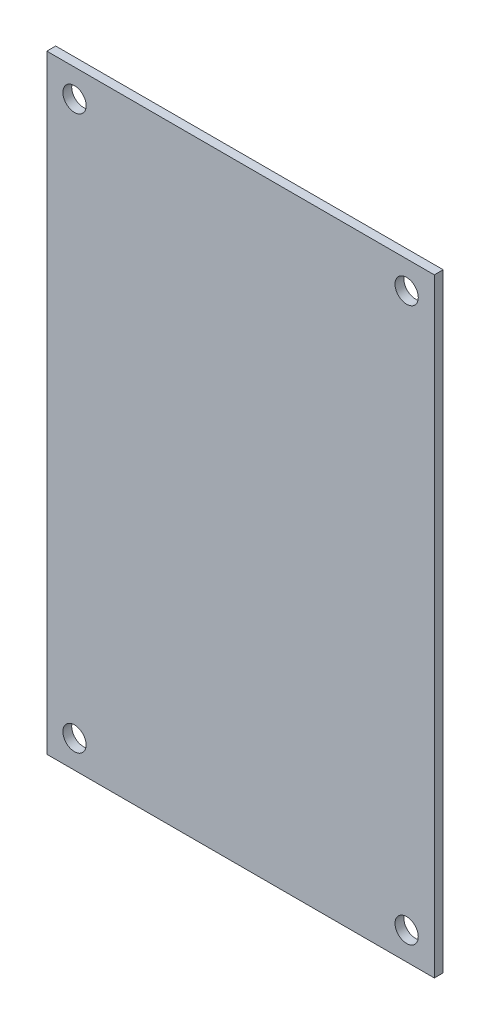
ISO-10303-21;
HEADER;
FILE_DESCRIPTION(('STEP AP214'),'2;1');
FILE_NAME('part.step','',(''),(''),'','','');
FILE_SCHEMA(('AUTOMOTIVE_DESIGN { 1 0 10303 214 1 1 1 1 }'));
ENDSEC;
DATA;
#1=APPLICATION_CONTEXT('core data for automotive mechanical design processes');
#2=APPLICATION_PROTOCOL_DEFINITION('international standard','automotive_design',2000,#1);
#3=PRODUCT_CONTEXT('',#1,'mechanical');
#4=PRODUCT('Part','Part','',(#3));
#5=PRODUCT_RELATED_PRODUCT_CATEGORY('part','',(#4));
#6=PRODUCT_DEFINITION_FORMATION('','',#4);
#7=PRODUCT_DEFINITION_CONTEXT('part definition',#1,'design');
#8=PRODUCT_DEFINITION('design','',#6,#7);
#9=PRODUCT_DEFINITION_SHAPE('','',#8);
#10=(LENGTH_UNIT() NAMED_UNIT(*) SI_UNIT(.MILLI.,.METRE.));
#11=(NAMED_UNIT(*) PLANE_ANGLE_UNIT() SI_UNIT($,.RADIAN.));
#12=(NAMED_UNIT(*) SI_UNIT($,.STERADIAN.) SOLID_ANGLE_UNIT());
#13=UNCERTAINTY_MEASURE_WITH_UNIT(LENGTH_MEASURE(1.E-05),#10,'distance_accuracy_value','');
#14=(GEOMETRIC_REPRESENTATION_CONTEXT(3) GLOBAL_UNCERTAINTY_ASSIGNED_CONTEXT((#13)) GLOBAL_UNIT_ASSIGNED_CONTEXT((#10,
#11,#12)) REPRESENTATION_CONTEXT('',''));
#15=CARTESIAN_POINT('',(0.,0.,0.));
#16=DIRECTION('',(0.,0.,1.));
#17=DIRECTION('',(1.,0.,0.));
#18=AXIS2_PLACEMENT_3D('',#15,#16,#17);
#19=CARTESIAN_POINT('',(35.,55.,0.));
#20=DIRECTION('',(0.,0.,1.));
#21=DIRECTION('',(1.,0.,0.));
#22=AXIS2_PLACEMENT_3D('',#19,#20,#21);
#23=PLANE('',#22);
#24=CARTESIAN_POINT('',(5.,5.,0.));
#25=DIRECTION('',(0.,0.,1.));
#26=DIRECTION('',(1.,0.,0.));
#27=AXIS2_PLACEMENT_3D('',#24,#25,#26);
#28=CIRCLE('',#27,2.1);
#29=CARTESIAN_POINT('',(7.1,5.,0.));
#30=VERTEX_POINT('',#29);
#31=EDGE_CURVE('E94',#30,#30,#28,.T.);
#32=ORIENTED_EDGE('',*,*,#31,.T.);
#33=EDGE_LOOP('',(#32));
#34=FACE_BOUND('',#33,.T.);
#35=CARTESIAN_POINT('',(5.,105.,0.));
#36=DIRECTION('',(0.,0.,1.));
#37=DIRECTION('',(1.,0.,0.));
#38=AXIS2_PLACEMENT_3D('',#35,#36,#37);
#39=CIRCLE('',#38,2.1);
#40=CARTESIAN_POINT('',(7.1,105.,0.));
#41=VERTEX_POINT('',#40);
#42=EDGE_CURVE('E98',#41,#41,#39,.T.);
#43=ORIENTED_EDGE('',*,*,#42,.T.);
#44=EDGE_LOOP('',(#43));
#45=FACE_BOUND('',#44,.T.);
#46=CARTESIAN_POINT('',(65.,5.,0.));
#47=DIRECTION('',(0.,0.,1.));
#48=DIRECTION('',(1.,0.,0.));
#49=AXIS2_PLACEMENT_3D('',#46,#47,#48);
#50=CIRCLE('',#49,2.1);
#51=CARTESIAN_POINT('',(67.1,5.,0.));
#52=VERTEX_POINT('',#51);
#53=EDGE_CURVE('E101',#52,#52,#50,.T.);
#54=ORIENTED_EDGE('',*,*,#53,.T.);
#55=EDGE_LOOP('',(#54));
#56=FACE_BOUND('',#55,.T.);
#57=CARTESIAN_POINT('',(65.,105.,0.));
#58=DIRECTION('',(0.,0.,1.));
#59=DIRECTION('',(1.,0.,0.));
#60=AXIS2_PLACEMENT_3D('',#57,#58,#59);
#61=CIRCLE('',#60,2.1);
#62=CARTESIAN_POINT('',(67.1,105.,0.));
#63=VERTEX_POINT('',#62);
#64=EDGE_CURVE('E20',#63,#63,#61,.T.);
#65=ORIENTED_EDGE('',*,*,#64,.T.);
#66=EDGE_LOOP('',(#65));
#67=FACE_BOUND('',#66,.T.);
#68=DIRECTION('',(0.,1.,0.));
#69=VECTOR('',#68,1.);
#70=CARTESIAN_POINT('',(0.,0.,0.));
#71=LINE('',#70,#69);
#72=CARTESIAN_POINT('',(0.,110.,0.));
#73=VERTEX_POINT('',#72);
#74=CARTESIAN_POINT('',(0.,0.,0.));
#75=VERTEX_POINT('',#74);
#76=EDGE_CURVE('E62',#73,#75,#71,.F.);
#77=ORIENTED_EDGE('',*,*,#76,.F.);
#78=DIRECTION('',(1.,0.,0.));
#79=VECTOR('',#78,1.);
#80=CARTESIAN_POINT('',(0.,110.,0.));
#81=LINE('',#80,#79);
#82=CARTESIAN_POINT('',(70.,110.,0.));
#83=VERTEX_POINT('',#82);
#84=EDGE_CURVE('E109',#83,#73,#81,.F.);
#85=ORIENTED_EDGE('',*,*,#84,.F.);
#86=DIRECTION('',(0.,1.,0.));
#87=VECTOR('',#86,1.);
#88=CARTESIAN_POINT('',(70.,110.,0.));
#89=LINE('',#88,#87);
#90=CARTESIAN_POINT('',(70.,0.,0.));
#91=VERTEX_POINT('',#90);
#92=EDGE_CURVE('E73',#91,#83,#89,.T.);
#93=ORIENTED_EDGE('',*,*,#92,.F.);
#94=DIRECTION('',(1.,0.,0.));
#95=VECTOR('',#94,1.);
#96=CARTESIAN_POINT('',(70.,0.,0.));
#97=LINE('',#96,#95);
#98=EDGE_CURVE('E57',#75,#91,#97,.T.);
#99=ORIENTED_EDGE('',*,*,#98,.F.);
#100=EDGE_LOOP('',(#77,#85,#93,#99));
#101=FACE_BOUND('',#100,.T.);
#102=ADVANCED_FACE('F17',(#34,#45,#56,#67,#101),#23,.F.);
#103=CARTESIAN_POINT('',(0.,0.,0.));
#104=DIRECTION('',(-1.,0.,0.));
#105=DIRECTION('',(0.,0.,1.));
#106=AXIS2_PLACEMENT_3D('',#103,#104,#105);
#107=PLANE('',#106);
#108=ORIENTED_EDGE('',*,*,#76,.T.);
#109=DIRECTION('',(0.,0.,-1.));
#110=VECTOR('',#109,1.);
#111=CARTESIAN_POINT('',(0.,0.,0.));
#112=LINE('',#111,#110);
#113=CARTESIAN_POINT('',(0.,0.,1.6));
#114=VERTEX_POINT('',#113);
#115=EDGE_CURVE('E64',#114,#75,#112,.T.);
#116=ORIENTED_EDGE('',*,*,#115,.F.);
#117=DIRECTION('',(0.,1.,0.));
#118=VECTOR('',#117,1.);
#119=CARTESIAN_POINT('',(0.,55.,1.6));
#120=LINE('',#119,#118);
#121=CARTESIAN_POINT('',(0.,110.,1.6));
#122=VERTEX_POINT('',#121);
#123=EDGE_CURVE('E97',#122,#114,#120,.F.);
#124=ORIENTED_EDGE('',*,*,#123,.F.);
#125=DIRECTION('',(0.,0.,1.));
#126=VECTOR('',#125,1.);
#127=CARTESIAN_POINT('',(0.,110.,0.));
#128=LINE('',#127,#126);
#129=EDGE_CURVE('E67',#73,#122,#128,.T.);
#130=ORIENTED_EDGE('',*,*,#129,.F.);
#131=EDGE_LOOP('',(#108,#116,#124,#130));
#132=FACE_BOUND('',#131,.T.);
#133=ADVANCED_FACE('F63',(#132),#107,.T.);
#134=CARTESIAN_POINT('',(70.,0.,0.));
#135=DIRECTION('',(0.,-1.,0.));
#136=DIRECTION('',(0.,0.,-1.));
#137=AXIS2_PLACEMENT_3D('',#134,#135,#136);
#138=PLANE('',#137);
#139=ORIENTED_EDGE('',*,*,#98,.T.);
#140=DIRECTION('',(0.,0.,-1.));
#141=VECTOR('',#140,1.);
#142=CARTESIAN_POINT('',(70.,0.,0.));
#143=LINE('',#142,#141);
#144=CARTESIAN_POINT('',(70.,0.,1.6));
#145=VERTEX_POINT('',#144);
#146=EDGE_CURVE('E75',#145,#91,#143,.T.);
#147=ORIENTED_EDGE('',*,*,#146,.F.);
#148=DIRECTION('',(1.,0.,0.));
#149=VECTOR('',#148,1.);
#150=CARTESIAN_POINT('',(35.,0.,1.6));
#151=LINE('',#150,#149);
#152=EDGE_CURVE('E79',#114,#145,#151,.T.);
#153=ORIENTED_EDGE('',*,*,#152,.F.);
#154=ORIENTED_EDGE('',*,*,#115,.T.);
#155=EDGE_LOOP('',(#139,#147,#153,#154));
#156=FACE_BOUND('',#155,.T.);
#157=ADVANCED_FACE('F77',(#156),#138,.T.);
#158=CARTESIAN_POINT('',(70.,110.,0.));
#159=DIRECTION('',(1.,0.,0.));
#160=DIRECTION('',(0.,0.,-1.));
#161=AXIS2_PLACEMENT_3D('',#158,#159,#160);
#162=PLANE('',#161);
#163=ORIENTED_EDGE('',*,*,#92,.T.);
#164=DIRECTION('',(0.,0.,1.));
#165=VECTOR('',#164,1.);
#166=CARTESIAN_POINT('',(70.,110.,0.));
#167=LINE('',#166,#165);
#168=CARTESIAN_POINT('',(70.,110.,1.6));
#169=VERTEX_POINT('',#168);
#170=EDGE_CURVE('E35',#169,#83,#167,.F.);
#171=ORIENTED_EDGE('',*,*,#170,.F.);
#172=DIRECTION('',(0.,1.,0.));
#173=VECTOR('',#172,1.);
#174=CARTESIAN_POINT('',(70.,55.,1.6));
#175=LINE('',#174,#173);
#176=EDGE_CURVE('E124',#145,#169,#175,.T.);
#177=ORIENTED_EDGE('',*,*,#176,.F.);
#178=ORIENTED_EDGE('',*,*,#146,.T.);
#179=EDGE_LOOP('',(#163,#171,#177,#178));
#180=FACE_BOUND('',#179,.T.);
#181=ADVANCED_FACE('F122',(#180),#162,.T.);
#182=CARTESIAN_POINT('',(0.,110.,0.));
#183=DIRECTION('',(0.,1.,0.));
#184=DIRECTION('',(0.,0.,1.));
#185=AXIS2_PLACEMENT_3D('',#182,#183,#184);
#186=PLANE('',#185);
#187=ORIENTED_EDGE('',*,*,#84,.T.);
#188=ORIENTED_EDGE('',*,*,#129,.T.);
#189=DIRECTION('',(1.,0.,0.));
#190=VECTOR('',#189,1.);
#191=CARTESIAN_POINT('',(35.,110.,1.6));
#192=LINE('',#191,#190);
#193=EDGE_CURVE('E93',#169,#122,#192,.F.);
#194=ORIENTED_EDGE('',*,*,#193,.F.);
#195=ORIENTED_EDGE('',*,*,#170,.T.);
#196=EDGE_LOOP('',(#187,#188,#194,#195));
#197=FACE_BOUND('',#196,.T.);
#198=ADVANCED_FACE('F131',(#197),#186,.T.);
#199=CARTESIAN_POINT('',(65.,105.,0.));
#200=DIRECTION('',(0.,0.,1.));
#201=DIRECTION('',(1.,0.,0.));
#202=AXIS2_PLACEMENT_3D('',#199,#200,#201);
#203=CYLINDRICAL_SURFACE('',#202,2.1);
#204=ORIENTED_EDGE('',*,*,#64,.F.);
#205=EDGE_LOOP('',(#204));
#206=FACE_BOUND('',#205,.T.);
#207=CARTESIAN_POINT('',(65.,105.,1.6));
#208=DIRECTION('',(0.,0.,1.));
#209=DIRECTION('',(1.,0.,0.));
#210=AXIS2_PLACEMENT_3D('',#207,#208,#209);
#211=CIRCLE('',#210,2.1);
#212=CARTESIAN_POINT('',(67.1,105.,1.6));
#213=VERTEX_POINT('',#212);
#214=EDGE_CURVE('E90',#213,#213,#211,.F.);
#215=ORIENTED_EDGE('',*,*,#214,.F.);
#216=EDGE_LOOP('',(#215));
#217=FACE_BOUND('',#216,.T.);
#218=ADVANCED_FACE('F133',(#206,#217),#203,.F.);
#219=CARTESIAN_POINT('',(65.,5.,0.));
#220=DIRECTION('',(0.,0.,1.));
#221=DIRECTION('',(1.,0.,0.));
#222=AXIS2_PLACEMENT_3D('',#219,#220,#221);
#223=CYLINDRICAL_SURFACE('',#222,2.1);
#224=ORIENTED_EDGE('',*,*,#53,.F.);
#225=EDGE_LOOP('',(#224));
#226=FACE_BOUND('',#225,.T.);
#227=CARTESIAN_POINT('',(65.,5.,1.6));
#228=DIRECTION('',(0.,0.,1.));
#229=DIRECTION('',(1.,0.,0.));
#230=AXIS2_PLACEMENT_3D('',#227,#228,#229);
#231=CIRCLE('',#230,2.1);
#232=CARTESIAN_POINT('',(67.1,5.,1.6));
#233=VERTEX_POINT('',#232);
#234=EDGE_CURVE('E87',#233,#233,#231,.F.);
#235=ORIENTED_EDGE('',*,*,#234,.F.);
#236=EDGE_LOOP('',(#235));
#237=FACE_BOUND('',#236,.T.);
#238=ADVANCED_FACE('F140',(#226,#237),#223,.F.);
#239=CARTESIAN_POINT('',(5.,105.,0.));
#240=DIRECTION('',(0.,0.,1.));
#241=DIRECTION('',(1.,0.,0.));
#242=AXIS2_PLACEMENT_3D('',#239,#240,#241);
#243=CYLINDRICAL_SURFACE('',#242,2.1);
#244=ORIENTED_EDGE('',*,*,#42,.F.);
#245=EDGE_LOOP('',(#244));
#246=FACE_BOUND('',#245,.T.);
#247=CARTESIAN_POINT('',(5.,105.,1.6));
#248=DIRECTION('',(0.,0.,1.));
#249=DIRECTION('',(1.,0.,0.));
#250=AXIS2_PLACEMENT_3D('',#247,#248,#249);
#251=CIRCLE('',#250,2.1);
#252=CARTESIAN_POINT('',(7.1,105.,1.6));
#253=VERTEX_POINT('',#252);
#254=EDGE_CURVE('E26',#253,#253,#251,.F.);
#255=ORIENTED_EDGE('',*,*,#254,.F.);
#256=EDGE_LOOP('',(#255));
#257=FACE_BOUND('',#256,.T.);
#258=ADVANCED_FACE('F151',(#246,#257),#243,.F.);
#259=CARTESIAN_POINT('',(5.,5.,0.));
#260=DIRECTION('',(0.,0.,1.));
#261=DIRECTION('',(1.,0.,0.));
#262=AXIS2_PLACEMENT_3D('',#259,#260,#261);
#263=CYLINDRICAL_SURFACE('',#262,2.1);
#264=ORIENTED_EDGE('',*,*,#31,.F.);
#265=EDGE_LOOP('',(#264));
#266=FACE_BOUND('',#265,.T.);
#267=CARTESIAN_POINT('',(5.,5.,1.6));
#268=DIRECTION('',(0.,0.,1.));
#269=DIRECTION('',(1.,0.,0.));
#270=AXIS2_PLACEMENT_3D('',#267,#268,#269);
#271=CIRCLE('',#270,2.1);
#272=CARTESIAN_POINT('',(7.1,5.,1.6));
#273=VERTEX_POINT('',#272);
#274=EDGE_CURVE('E11',#273,#273,#271,.F.);
#275=ORIENTED_EDGE('',*,*,#274,.F.);
#276=EDGE_LOOP('',(#275));
#277=FACE_BOUND('',#276,.T.);
#278=ADVANCED_FACE('F145',(#266,#277),#263,.F.);
#279=CARTESIAN_POINT('',(35.,55.,1.6));
#280=DIRECTION('',(0.,0.,1.));
#281=DIRECTION('',(1.,0.,0.));
#282=AXIS2_PLACEMENT_3D('',#279,#280,#281);
#283=PLANE('',#282);
#284=ORIENTED_EDGE('',*,*,#274,.T.);
#285=EDGE_LOOP('',(#284));
#286=FACE_BOUND('',#285,.T.);
#287=ORIENTED_EDGE('',*,*,#254,.T.);
#288=EDGE_LOOP('',(#287));
#289=FACE_BOUND('',#288,.T.);
#290=ORIENTED_EDGE('',*,*,#234,.T.);
#291=EDGE_LOOP('',(#290));
#292=FACE_BOUND('',#291,.T.);
#293=ORIENTED_EDGE('',*,*,#214,.T.);
#294=EDGE_LOOP('',(#293));
#295=FACE_BOUND('',#294,.T.);
#296=ORIENTED_EDGE('',*,*,#176,.T.);
#297=ORIENTED_EDGE('',*,*,#193,.T.);
#298=ORIENTED_EDGE('',*,*,#123,.T.);
#299=ORIENTED_EDGE('',*,*,#152,.T.);
#300=EDGE_LOOP('',(#296,#297,#298,#299));
#301=FACE_BOUND('',#300,.T.);
#302=ADVANCED_FACE('F128',(#286,#289,#292,#295,#301),#283,.T.);
#303=CLOSED_SHELL('',(#102,#133,#157,#181,#198,#218,#238,#258,#278,#302));
#304=MANIFOLD_SOLID_BREP('B1',#303);
#305=ADVANCED_BREP_SHAPE_REPRESENTATION('',(#18,#304),#14);
#306=SHAPE_DEFINITION_REPRESENTATION(#9,#305);
ENDSEC;
END-ISO-10303-21;
